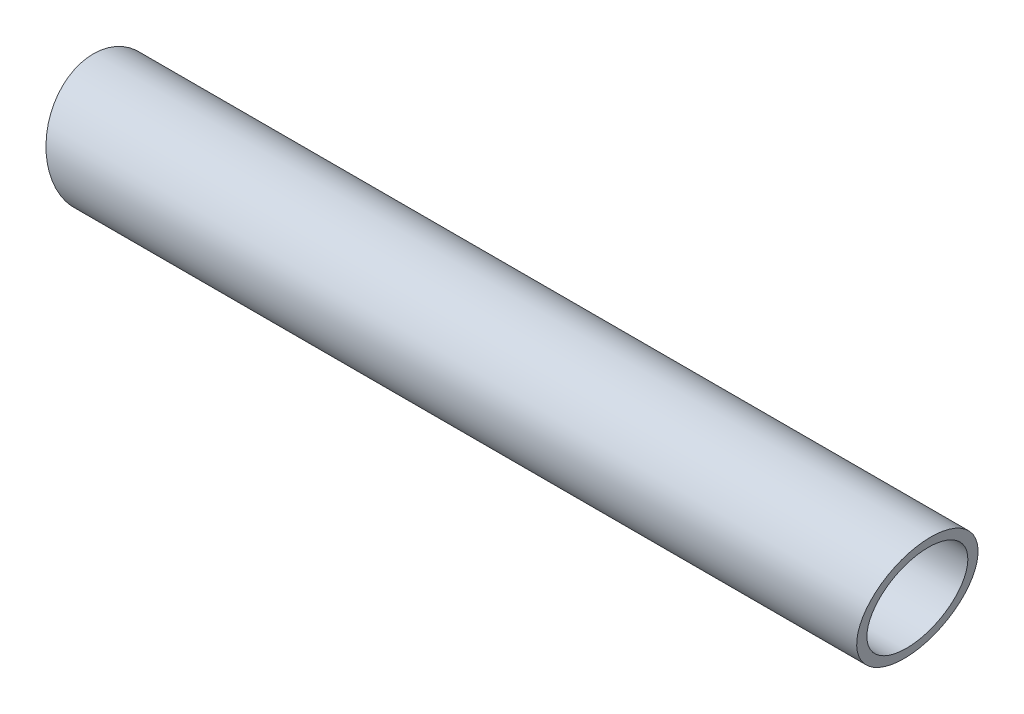
ISO-10303-21;
HEADER;
FILE_DESCRIPTION(('STEP AP214'),'2;1');
FILE_NAME('part.step','',(''),(''),'','','');
FILE_SCHEMA(('AUTOMOTIVE_DESIGN { 1 0 10303 214 1 1 1 1 }'));
ENDSEC;
DATA;
#1=APPLICATION_CONTEXT('core data for automotive mechanical design processes');
#2=APPLICATION_PROTOCOL_DEFINITION('international standard','automotive_design',2000,#1);
#3=PRODUCT_CONTEXT('',#1,'mechanical');
#4=PRODUCT('Part','Part','',(#3));
#5=PRODUCT_RELATED_PRODUCT_CATEGORY('part','',(#4));
#6=PRODUCT_DEFINITION_FORMATION('','',#4);
#7=PRODUCT_DEFINITION_CONTEXT('part definition',#1,'design');
#8=PRODUCT_DEFINITION('design','',#6,#7);
#9=PRODUCT_DEFINITION_SHAPE('','',#8);
#10=(LENGTH_UNIT() NAMED_UNIT(*) SI_UNIT(.MILLI.,.METRE.));
#11=(NAMED_UNIT(*) PLANE_ANGLE_UNIT() SI_UNIT($,.RADIAN.));
#12=(NAMED_UNIT(*) SI_UNIT($,.STERADIAN.) SOLID_ANGLE_UNIT());
#13=UNCERTAINTY_MEASURE_WITH_UNIT(LENGTH_MEASURE(1.E-05),#10,'distance_accuracy_value','');
#14=(GEOMETRIC_REPRESENTATION_CONTEXT(3) GLOBAL_UNCERTAINTY_ASSIGNED_CONTEXT((#13)) GLOBAL_UNIT_ASSIGNED_CONTEXT((#10,
#11,#12)) REPRESENTATION_CONTEXT('',''));
#15=CARTESIAN_POINT('',(0.,0.,0.));
#16=DIRECTION('',(0.,0.,1.));
#17=DIRECTION('',(1.,0.,0.));
#18=AXIS2_PLACEMENT_3D('',#15,#16,#17);
#19=CARTESIAN_POINT('',(-65.0000000000003,539.999999999999,-1140.));
#20=DIRECTION('',(1.,0.,0.));
#21=DIRECTION('',(0.,0.,-1.));
#22=AXIS2_PLACEMENT_3D('',#19,#20,#21);
#23=CYLINDRICAL_SURFACE('',#22,7.90000000000002);
#24=CARTESIAN_POINT('',(-64.9999999999999,539.999999999999,-1140.));
#25=DIRECTION('',(-0.975914622854119,-0.218152810890676,0.));
#26=DIRECTION('',(0.218152810890676,-0.975914622854119,0.));
#27=AXIS2_PLACEMENT_3D('',#24,#25,#26);
#28=ELLIPSE('',#27,8.09497041544065,7.90000000000002);
#29=CARTESIAN_POINT('',(-63.2340594497946,532.099999999999,-1140.));
#30=VERTEX_POINT('',#29);
#31=EDGE_CURVE('E51',#30,#30,#28,.T.);
#32=ORIENTED_EDGE('',*,*,#31,.T.);
#33=EDGE_LOOP('',(#32));
#34=FACE_BOUND('',#33,.T.);
#35=CARTESIAN_POINT('',(64.9999999999999,539.999999999999,-1140.));
#36=DIRECTION('',(0.975914622854119,-0.218152810890675,0.));
#37=DIRECTION('',(0.218152810890675,0.975914622854119,0.));
#38=AXIS2_PLACEMENT_3D('',#35,#36,#37);
#39=ELLIPSE('',#38,8.09497041544066,7.90000000000002);
#40=CARTESIAN_POINT('',(66.7659405502051,547.899999999999,-1140.));
#41=VERTEX_POINT('',#40);
#42=EDGE_CURVE('E41',#41,#41,#39,.T.);
#43=ORIENTED_EDGE('',*,*,#42,.T.);
#44=EDGE_LOOP('',(#43));
#45=FACE_BOUND('',#44,.T.);
#46=ADVANCED_FACE('F37',(#34,#45),#23,.F.);
#47=CARTESIAN_POINT('',(-65.0000000000003,539.999999999999,-1140.));
#48=DIRECTION('',(1.,0.,0.));
#49=DIRECTION('',(0.,0.,-1.));
#50=AXIS2_PLACEMENT_3D('',#47,#48,#49);
#51=CYLINDRICAL_SURFACE('',#50,9.49999999999999);
#52=CARTESIAN_POINT('',(-64.9999999999999,539.999999999999,-1140.));
#53=DIRECTION('',(-0.975914622854119,-0.218152810890676,0.));
#54=DIRECTION('',(0.218152810890676,-0.975914622854119,0.));
#55=AXIS2_PLACEMENT_3D('',#52,#53,#54);
#56=ELLIPSE('',#55,9.73445809451721,9.49999999999999);
#57=CARTESIAN_POINT('',(-62.8764006041835,530.499999999999,-1140.));
#58=VERTEX_POINT('',#57);
#59=EDGE_CURVE('E45',#58,#58,#56,.T.);
#60=ORIENTED_EDGE('',*,*,#59,.F.);
#61=EDGE_LOOP('',(#60));
#62=FACE_BOUND('',#61,.T.);
#63=CARTESIAN_POINT('',(64.9999999999999,539.999999999999,-1140.));
#64=DIRECTION('',(0.975914622854119,-0.218152810890675,0.));
#65=DIRECTION('',(0.218152810890675,0.975914622854119,0.));
#66=AXIS2_PLACEMENT_3D('',#63,#64,#65);
#67=ELLIPSE('',#66,9.73445809451721,9.49999999999999);
#68=CARTESIAN_POINT('',(67.1235993958163,549.499999999999,-1140.));
#69=VERTEX_POINT('',#68);
#70=EDGE_CURVE('E10',#69,#69,#67,.T.);
#71=ORIENTED_EDGE('',*,*,#70,.F.);
#72=EDGE_LOOP('',(#71));
#73=FACE_BOUND('',#72,.T.);
#74=ADVANCED_FACE('F65',(#62,#73),#51,.T.);
#75=CARTESIAN_POINT('',(-65.,540.,-1140.));
#76=DIRECTION('',(-0.975914622854119,-0.218152810890676,0.));
#77=DIRECTION('',(0.218152810890676,-0.975914622854119,0.));
#78=AXIS2_PLACEMENT_3D('',#75,#76,#77);
#79=PLANE('',#78);
#80=ORIENTED_EDGE('',*,*,#31,.F.);
#81=EDGE_LOOP('',(#80));
#82=FACE_BOUND('',#81,.T.);
#83=ORIENTED_EDGE('',*,*,#59,.T.);
#84=EDGE_LOOP('',(#83));
#85=FACE_BOUND('',#84,.T.);
#86=ADVANCED_FACE('F60',(#82,#85),#79,.T.);
#87=CARTESIAN_POINT('',(65.,540.,-1140.));
#88=DIRECTION('',(0.975914622854119,-0.218152810890675,0.));
#89=DIRECTION('',(0.218152810890675,0.975914622854119,0.));
#90=AXIS2_PLACEMENT_3D('',#87,#88,#89);
#91=PLANE('',#90);
#92=ORIENTED_EDGE('',*,*,#42,.F.);
#93=EDGE_LOOP('',(#92));
#94=FACE_BOUND('',#93,.T.);
#95=ORIENTED_EDGE('',*,*,#70,.T.);
#96=EDGE_LOOP('',(#95));
#97=FACE_BOUND('',#96,.T.);
#98=ADVANCED_FACE('F39',(#94,#97),#91,.T.);
#99=CLOSED_SHELL('',(#46,#74,#86,#98));
#100=MANIFOLD_SOLID_BREP('B2',#99);
#101=ADVANCED_BREP_SHAPE_REPRESENTATION('',(#18,#100),#14);
#102=SHAPE_DEFINITION_REPRESENTATION(#9,#101);
ENDSEC;
END-ISO-10303-21;
